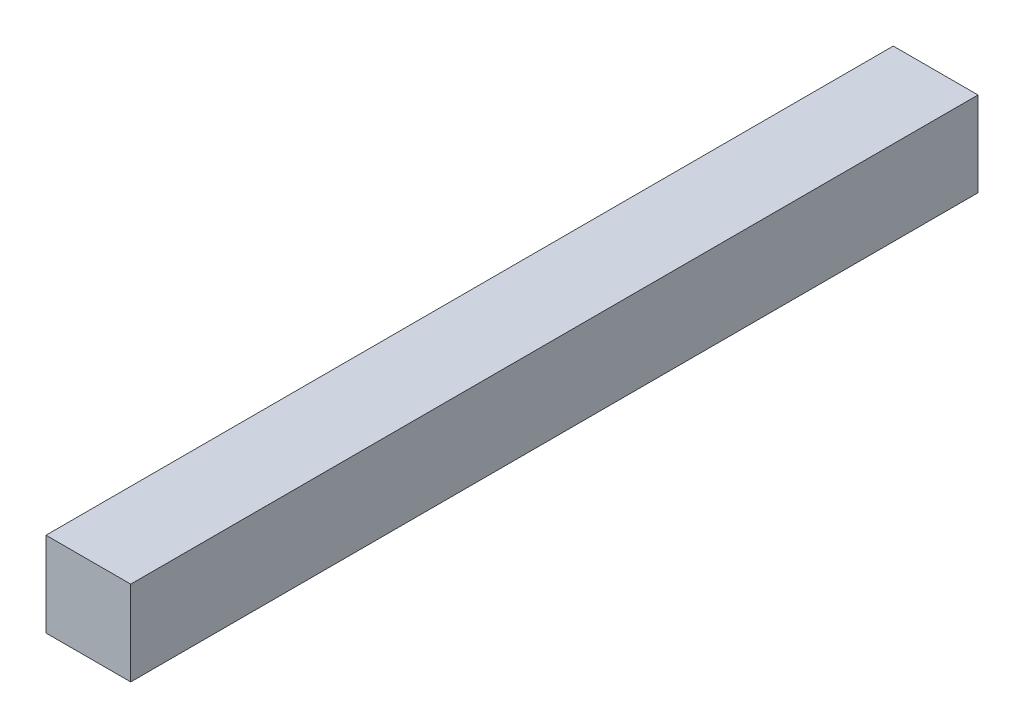
ISO-10303-21;
HEADER;
FILE_DESCRIPTION(('STEP AP214'),'2;1');
FILE_NAME('part.step','',(''),(''),'','','');
FILE_SCHEMA(('AUTOMOTIVE_DESIGN { 1 0 10303 214 1 1 1 1 }'));
ENDSEC;
DATA;
#1=APPLICATION_CONTEXT('core data for automotive mechanical design processes');
#2=APPLICATION_PROTOCOL_DEFINITION('international standard','automotive_design',2000,#1);
#3=PRODUCT_CONTEXT('',#1,'mechanical');
#4=PRODUCT('Part','Part','',(#3));
#5=PRODUCT_RELATED_PRODUCT_CATEGORY('part','',(#4));
#6=PRODUCT_DEFINITION_FORMATION('','',#4);
#7=PRODUCT_DEFINITION_CONTEXT('part definition',#1,'design');
#8=PRODUCT_DEFINITION('design','',#6,#7);
#9=PRODUCT_DEFINITION_SHAPE('','',#8);
#10=(LENGTH_UNIT() NAMED_UNIT(*) SI_UNIT(.MILLI.,.METRE.));
#11=(NAMED_UNIT(*) PLANE_ANGLE_UNIT() SI_UNIT($,.RADIAN.));
#12=(NAMED_UNIT(*) SI_UNIT($,.STERADIAN.) SOLID_ANGLE_UNIT());
#13=UNCERTAINTY_MEASURE_WITH_UNIT(LENGTH_MEASURE(1.E-05),#10,'distance_accuracy_value','');
#14=(GEOMETRIC_REPRESENTATION_CONTEXT(3) GLOBAL_UNCERTAINTY_ASSIGNED_CONTEXT((#13)) GLOBAL_UNIT_ASSIGNED_CONTEXT((#10,
#11,#12)) REPRESENTATION_CONTEXT('',''));
#15=CARTESIAN_POINT('',(0.,0.,0.));
#16=DIRECTION('',(0.,0.,1.));
#17=DIRECTION('',(1.,0.,0.));
#18=AXIS2_PLACEMENT_3D('',#15,#16,#17);
#19=CARTESIAN_POINT('',(0.,0.,10000.));
#20=DIRECTION('',(1.,0.,0.));
#21=DIRECTION('',(0.,0.,-1.));
#22=AXIS2_PLACEMENT_3D('',#19,#20,#21);
#23=PLANE('',#22);
#24=DIRECTION('',(0.,-1.,0.));
#25=VECTOR('',#24,1.);
#26=CARTESIAN_POINT('',(0.,0.,0.));
#27=LINE('',#26,#25);
#28=CARTESIAN_POINT('',(0.,1000.,0.));
#29=VERTEX_POINT('',#28);
#30=CARTESIAN_POINT('',(0.,0.,0.));
#31=VERTEX_POINT('',#30);
#32=EDGE_CURVE('E84',#29,#31,#27,.T.);
#33=ORIENTED_EDGE('',*,*,#32,.T.);
#34=DIRECTION('',(0.,0.,-1.));
#35=VECTOR('',#34,1.);
#36=CARTESIAN_POINT('',(0.,0.,10000.));
#37=LINE('',#36,#35);
#38=CARTESIAN_POINT('',(0.,0.,10000.));
#39=VERTEX_POINT('',#38);
#40=EDGE_CURVE('E11',#39,#31,#37,.T.);
#41=ORIENTED_EDGE('',*,*,#40,.F.);
#42=DIRECTION('',(0.,-1.,0.));
#43=VECTOR('',#42,1.);
#44=CARTESIAN_POINT('',(0.,0.,10000.));
#45=LINE('',#44,#43);
#46=CARTESIAN_POINT('',(0.,1000.,10000.));
#47=VERTEX_POINT('',#46);
#48=EDGE_CURVE('E102',#47,#39,#45,.T.);
#49=ORIENTED_EDGE('',*,*,#48,.F.);
#50=DIRECTION('',(0.,0.,-1.));
#51=VECTOR('',#50,1.);
#52=CARTESIAN_POINT('',(0.,1000.,10000.));
#53=LINE('',#52,#51);
#54=EDGE_CURVE('E96',#47,#29,#53,.T.);
#55=ORIENTED_EDGE('',*,*,#54,.T.);
#56=EDGE_LOOP('',(#33,#41,#49,#55));
#57=FACE_BOUND('',#56,.T.);
#58=ADVANCED_FACE('F40',(#57),#23,.F.);
#59=CARTESIAN_POINT('',(0.,0.,10000.));
#60=DIRECTION('',(0.,1.,0.));
#61=DIRECTION('',(0.,0.,1.));
#62=AXIS2_PLACEMENT_3D('',#59,#60,#61);
#63=PLANE('',#62);
#64=DIRECTION('',(1.,0.,0.));
#65=VECTOR('',#64,1.);
#66=CARTESIAN_POINT('',(0.,0.,0.));
#67=LINE('',#66,#65);
#68=CARTESIAN_POINT('',(1000.,0.,0.));
#69=VERTEX_POINT('',#68);
#70=EDGE_CURVE('E80',#31,#69,#67,.T.);
#71=ORIENTED_EDGE('',*,*,#70,.T.);
#72=DIRECTION('',(0.,0.,-1.));
#73=VECTOR('',#72,1.);
#74=CARTESIAN_POINT('',(1000.,0.,10000.));
#75=LINE('',#74,#73);
#76=CARTESIAN_POINT('',(1000.,0.,10000.));
#77=VERTEX_POINT('',#76);
#78=EDGE_CURVE('E47',#77,#69,#75,.T.);
#79=ORIENTED_EDGE('',*,*,#78,.F.);
#80=DIRECTION('',(1.,0.,0.));
#81=VECTOR('',#80,1.);
#82=CARTESIAN_POINT('',(0.,0.,10000.));
#83=LINE('',#82,#81);
#84=EDGE_CURVE('E92',#39,#77,#83,.T.);
#85=ORIENTED_EDGE('',*,*,#84,.F.);
#86=ORIENTED_EDGE('',*,*,#40,.T.);
#87=EDGE_LOOP('',(#71,#79,#85,#86));
#88=FACE_BOUND('',#87,.T.);
#89=ADVANCED_FACE('F91',(#88),#63,.F.);
#90=CARTESIAN_POINT('',(1000.,0.,10000.));
#91=DIRECTION('',(-1.,0.,0.));
#92=DIRECTION('',(0.,0.,1.));
#93=AXIS2_PLACEMENT_3D('',#90,#91,#92);
#94=PLANE('',#93);
#95=DIRECTION('',(0.,1.,0.));
#96=VECTOR('',#95,1.);
#97=CARTESIAN_POINT('',(1000.,0.,0.));
#98=LINE('',#97,#96);
#99=CARTESIAN_POINT('',(1000.,1000.,0.));
#100=VERTEX_POINT('',#99);
#101=EDGE_CURVE('E85',#69,#100,#98,.T.);
#102=ORIENTED_EDGE('',*,*,#101,.T.);
#103=DIRECTION('',(0.,0.,-1.));
#104=VECTOR('',#103,1.);
#105=CARTESIAN_POINT('',(1000.,1000.,10000.));
#106=LINE('',#105,#104);
#107=CARTESIAN_POINT('',(1000.,1000.,10000.));
#108=VERTEX_POINT('',#107);
#109=EDGE_CURVE('E108',#108,#100,#106,.T.);
#110=ORIENTED_EDGE('',*,*,#109,.F.);
#111=DIRECTION('',(0.,1.,0.));
#112=VECTOR('',#111,1.);
#113=CARTESIAN_POINT('',(1000.,0.,10000.));
#114=LINE('',#113,#112);
#115=EDGE_CURVE('E59',#77,#108,#114,.T.);
#116=ORIENTED_EDGE('',*,*,#115,.F.);
#117=ORIENTED_EDGE('',*,*,#78,.T.);
#118=EDGE_LOOP('',(#102,#110,#116,#117));
#119=FACE_BOUND('',#118,.T.);
#120=ADVANCED_FACE('F111',(#119),#94,.F.);
#121=CARTESIAN_POINT('',(0.,1000.,10000.));
#122=DIRECTION('',(0.,-1.,0.));
#123=DIRECTION('',(0.,0.,-1.));
#124=AXIS2_PLACEMENT_3D('',#121,#122,#123);
#125=PLANE('',#124);
#126=DIRECTION('',(-1.,0.,0.));
#127=VECTOR('',#126,1.);
#128=CARTESIAN_POINT('',(0.,1000.,0.));
#129=LINE('',#128,#127);
#130=EDGE_CURVE('E100',#100,#29,#129,.T.);
#131=ORIENTED_EDGE('',*,*,#130,.T.);
#132=ORIENTED_EDGE('',*,*,#54,.F.);
#133=DIRECTION('',(-1.,0.,0.));
#134=VECTOR('',#133,1.);
#135=CARTESIAN_POINT('',(0.,1000.,10000.));
#136=LINE('',#135,#134);
#137=EDGE_CURVE('E54',#108,#47,#136,.T.);
#138=ORIENTED_EDGE('',*,*,#137,.F.);
#139=ORIENTED_EDGE('',*,*,#109,.T.);
#140=EDGE_LOOP('',(#131,#132,#138,#139));
#141=FACE_BOUND('',#140,.T.);
#142=ADVANCED_FACE('F113',(#141),#125,.F.);
#143=CARTESIAN_POINT('',(0.,1000.,10000.));
#144=DIRECTION('',(0.,0.,-1.));
#145=DIRECTION('',(-1.,0.,0.));
#146=AXIS2_PLACEMENT_3D('',#143,#144,#145);
#147=PLANE('',#146);
#148=ORIENTED_EDGE('',*,*,#48,.T.);
#149=ORIENTED_EDGE('',*,*,#84,.T.);
#150=ORIENTED_EDGE('',*,*,#115,.T.);
#151=ORIENTED_EDGE('',*,*,#137,.T.);
#152=EDGE_LOOP('',(#148,#149,#150,#151));
#153=FACE_BOUND('',#152,.T.);
#154=ADVANCED_FACE('F114',(#153),#147,.F.);
#155=CARTESIAN_POINT('',(0.,1000.,0.));
#156=DIRECTION('',(0.,0.,-1.));
#157=DIRECTION('',(-1.,0.,0.));
#158=AXIS2_PLACEMENT_3D('',#155,#156,#157);
#159=PLANE('',#158);
#160=ORIENTED_EDGE('',*,*,#32,.F.);
#161=ORIENTED_EDGE('',*,*,#130,.F.);
#162=ORIENTED_EDGE('',*,*,#101,.F.);
#163=ORIENTED_EDGE('',*,*,#70,.F.);
#164=EDGE_LOOP('',(#160,#161,#162,#163));
#165=FACE_BOUND('',#164,.T.);
#166=ADVANCED_FACE('F81',(#165),#159,.T.);
#167=CLOSED_SHELL('',(#58,#89,#120,#142,#154,#166));
#168=MANIFOLD_SOLID_BREP('B2',#167);
#169=ADVANCED_BREP_SHAPE_REPRESENTATION('',(#18,#168),#14);
#170=SHAPE_DEFINITION_REPRESENTATION(#9,#169);
ENDSEC;
END-ISO-10303-21;
